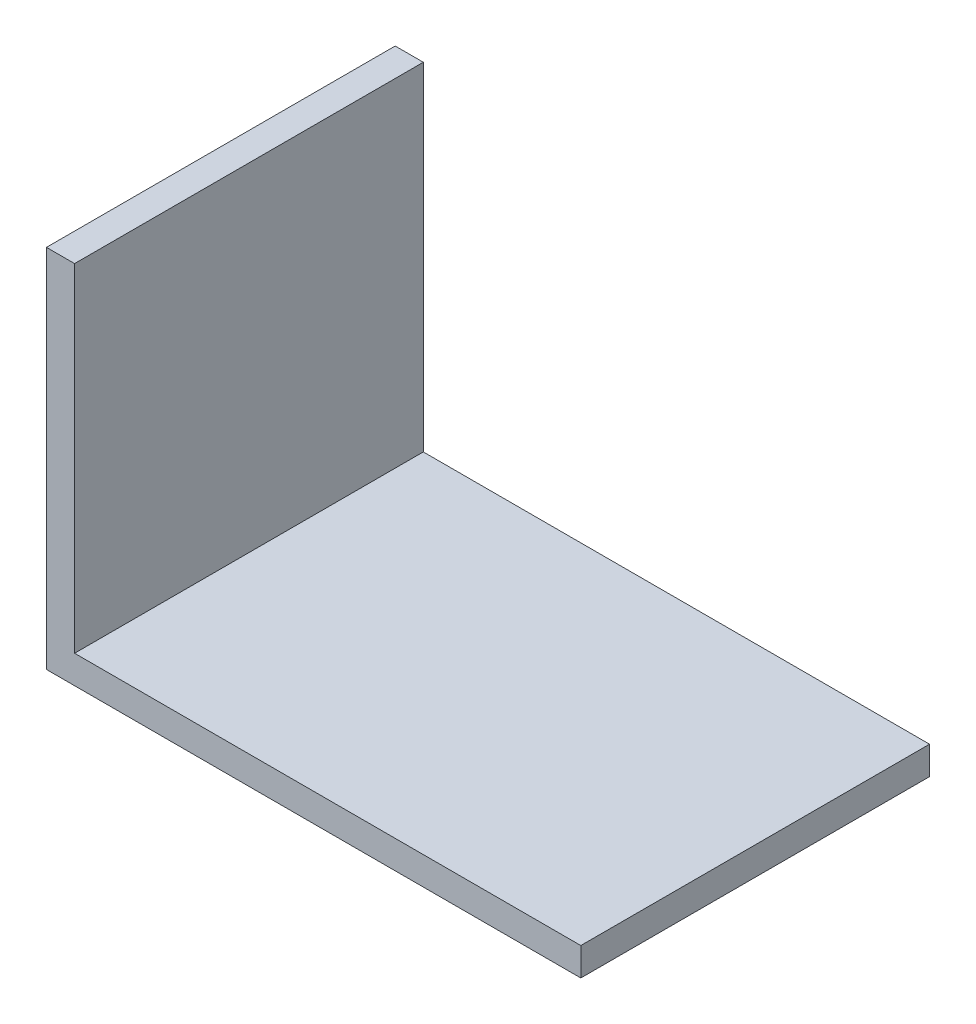
ISO-10303-21;
HEADER;
FILE_DESCRIPTION(('STEP AP214'),'2;1');
FILE_NAME('part.step','',(''),(''),'','','');
FILE_SCHEMA(('AUTOMOTIVE_DESIGN { 1 0 10303 214 1 1 1 1 }'));
ENDSEC;
DATA;
#1=APPLICATION_CONTEXT('core data for automotive mechanical design processes');
#2=APPLICATION_PROTOCOL_DEFINITION('international standard','automotive_design',2000,#1);
#3=PRODUCT_CONTEXT('',#1,'mechanical');
#4=PRODUCT('Part','Part','',(#3));
#5=PRODUCT_RELATED_PRODUCT_CATEGORY('part','',(#4));
#6=PRODUCT_DEFINITION_FORMATION('','',#4);
#7=PRODUCT_DEFINITION_CONTEXT('part definition',#1,'design');
#8=PRODUCT_DEFINITION('design','',#6,#7);
#9=PRODUCT_DEFINITION_SHAPE('','',#8);
#10=(LENGTH_UNIT() NAMED_UNIT(*) SI_UNIT(.MILLI.,.METRE.));
#11=(NAMED_UNIT(*) PLANE_ANGLE_UNIT() SI_UNIT($,.RADIAN.));
#12=(NAMED_UNIT(*) SI_UNIT($,.STERADIAN.) SOLID_ANGLE_UNIT());
#13=UNCERTAINTY_MEASURE_WITH_UNIT(LENGTH_MEASURE(1.E-05),#10,'distance_accuracy_value','');
#14=(GEOMETRIC_REPRESENTATION_CONTEXT(3) GLOBAL_UNCERTAINTY_ASSIGNED_CONTEXT((#13)) GLOBAL_UNIT_ASSIGNED_CONTEXT((#10,
#11,#12)) REPRESENTATION_CONTEXT('',''));
#15=CARTESIAN_POINT('',(0.,0.,0.));
#16=DIRECTION('',(0.,0.,1.));
#17=DIRECTION('',(1.,0.,0.));
#18=AXIS2_PLACEMENT_3D('',#15,#16,#17);
#19=CARTESIAN_POINT('',(2.5,-15.,15.5));
#20=DIRECTION('',(0.,0.,-1.));
#21=DIRECTION('',(-1.,0.,0.));
#22=AXIS2_PLACEMENT_3D('',#19,#20,#21);
#23=PLANE('',#22);
#24=DIRECTION('',(0.,-1.,0.));
#25=VECTOR('',#24,1.);
#26=CARTESIAN_POINT('',(0.,-15.,15.5));
#27=LINE('',#26,#25);
#28=CARTESIAN_POINT('',(0.,15.,15.5));
#29=VERTEX_POINT('',#28);
#30=CARTESIAN_POINT('',(0.,-17.5,15.5));
#31=VERTEX_POINT('',#30);
#32=EDGE_CURVE('E109',#29,#31,#27,.T.);
#33=ORIENTED_EDGE('',*,*,#32,.T.);
#34=DIRECTION('',(-1.,0.,0.));
#35=VECTOR('',#34,1.);
#36=CARTESIAN_POINT('',(47.5,-17.5,15.5));
#37=LINE('',#36,#35);
#38=CARTESIAN_POINT('',(47.5,-17.5,15.5));
#39=VERTEX_POINT('',#38);
#40=EDGE_CURVE('E113',#39,#31,#37,.T.);
#41=ORIENTED_EDGE('',*,*,#40,.F.);
#42=DIRECTION('',(0.,-1.,0.));
#43=VECTOR('',#42,1.);
#44=CARTESIAN_POINT('',(47.5,-15.,15.5));
#45=LINE('',#44,#43);
#46=CARTESIAN_POINT('',(47.5,-15.,15.5));
#47=VERTEX_POINT('',#46);
#48=EDGE_CURVE('E135',#47,#39,#45,.T.);
#49=ORIENTED_EDGE('',*,*,#48,.F.);
#50=DIRECTION('',(-1.,0.,0.));
#51=VECTOR('',#50,1.);
#52=CARTESIAN_POINT('',(47.5,-15.,15.5));
#53=LINE('',#52,#51);
#54=CARTESIAN_POINT('',(2.5,-15.,15.5));
#55=VERTEX_POINT('',#54);
#56=EDGE_CURVE('E94',#47,#55,#53,.T.);
#57=ORIENTED_EDGE('',*,*,#56,.T.);
#58=DIRECTION('',(0.,-1.,0.));
#59=VECTOR('',#58,1.);
#60=CARTESIAN_POINT('',(2.5,-15.,15.5));
#61=LINE('',#60,#59);
#62=CARTESIAN_POINT('',(2.5,15.,15.5));
#63=VERTEX_POINT('',#62);
#64=EDGE_CURVE('E99',#63,#55,#61,.T.);
#65=ORIENTED_EDGE('',*,*,#64,.F.);
#66=DIRECTION('',(-1.,0.,0.));
#67=VECTOR('',#66,1.);
#68=CARTESIAN_POINT('',(2.5,15.,15.5));
#69=LINE('',#68,#67);
#70=EDGE_CURVE('E48',#63,#29,#69,.T.);
#71=ORIENTED_EDGE('',*,*,#70,.T.);
#72=EDGE_LOOP('',(#33,#41,#49,#57,#65,#71));
#73=FACE_BOUND('',#72,.T.);
#74=ADVANCED_FACE('F39',(#73),#23,.F.);
#75=CARTESIAN_POINT('',(2.5,-15.,-15.5));
#76=DIRECTION('',(0.,0.,1.));
#77=DIRECTION('',(1.,0.,0.));
#78=AXIS2_PLACEMENT_3D('',#75,#76,#77);
#79=PLANE('',#78);
#80=DIRECTION('',(0.,1.,0.));
#81=VECTOR('',#80,1.);
#82=CARTESIAN_POINT('',(0.,-15.,-15.5));
#83=LINE('',#82,#81);
#84=CARTESIAN_POINT('',(0.,-17.5,-15.5));
#85=VERTEX_POINT('',#84);
#86=CARTESIAN_POINT('',(0.,15.,-15.5));
#87=VERTEX_POINT('',#86);
#88=EDGE_CURVE('E68',#85,#87,#83,.T.);
#89=ORIENTED_EDGE('',*,*,#88,.T.);
#90=DIRECTION('',(-1.,0.,0.));
#91=VECTOR('',#90,1.);
#92=CARTESIAN_POINT('',(2.5,15.,-15.5));
#93=LINE('',#92,#91);
#94=CARTESIAN_POINT('',(2.5,15.,-15.5));
#95=VERTEX_POINT('',#94);
#96=EDGE_CURVE('E11',#95,#87,#93,.T.);
#97=ORIENTED_EDGE('',*,*,#96,.F.);
#98=DIRECTION('',(0.,1.,0.));
#99=VECTOR('',#98,1.);
#100=CARTESIAN_POINT('',(2.5,-15.,-15.5));
#101=LINE('',#100,#99);
#102=CARTESIAN_POINT('',(2.5,-15.,-15.5));
#103=VERTEX_POINT('',#102);
#104=EDGE_CURVE('E97',#103,#95,#101,.T.);
#105=ORIENTED_EDGE('',*,*,#104,.F.);
#106=DIRECTION('',(-1.,0.,0.));
#107=VECTOR('',#106,1.);
#108=CARTESIAN_POINT('',(47.5,-15.,-15.5));
#109=LINE('',#108,#107);
#110=CARTESIAN_POINT('',(47.5,-15.,-15.5));
#111=VERTEX_POINT('',#110);
#112=EDGE_CURVE('E87',#111,#103,#109,.T.);
#113=ORIENTED_EDGE('',*,*,#112,.F.);
#114=DIRECTION('',(0.,1.,0.));
#115=VECTOR('',#114,1.);
#116=CARTESIAN_POINT('',(47.5,-15.,-15.5));
#117=LINE('',#116,#115);
#118=CARTESIAN_POINT('',(47.5,-17.5,-15.5));
#119=VERTEX_POINT('',#118);
#120=EDGE_CURVE('E154',#119,#111,#117,.T.);
#121=ORIENTED_EDGE('',*,*,#120,.F.);
#122=DIRECTION('',(-1.,0.,0.));
#123=VECTOR('',#122,1.);
#124=CARTESIAN_POINT('',(47.5,-17.5,-15.5));
#125=LINE('',#124,#123);
#126=EDGE_CURVE('E93',#119,#85,#125,.T.);
#127=ORIENTED_EDGE('',*,*,#126,.T.);
#128=EDGE_LOOP('',(#89,#97,#105,#113,#121,#127));
#129=FACE_BOUND('',#128,.T.);
#130=ADVANCED_FACE('F102',(#129),#79,.F.);
#131=CARTESIAN_POINT('',(2.5,15.,-15.5));
#132=DIRECTION('',(0.,-1.,0.));
#133=DIRECTION('',(0.,0.,-1.));
#134=AXIS2_PLACEMENT_3D('',#131,#132,#133);
#135=PLANE('',#134);
#136=DIRECTION('',(0.,0.,1.));
#137=VECTOR('',#136,1.);
#138=CARTESIAN_POINT('',(0.,15.,-15.5));
#139=LINE('',#138,#137);
#140=EDGE_CURVE('E116',#87,#29,#139,.T.);
#141=ORIENTED_EDGE('',*,*,#140,.T.);
#142=ORIENTED_EDGE('',*,*,#70,.F.);
#143=DIRECTION('',(0.,0.,1.));
#144=VECTOR('',#143,1.);
#145=CARTESIAN_POINT('',(2.5,15.,-15.5));
#146=LINE('',#145,#144);
#147=EDGE_CURVE('E56',#95,#63,#146,.T.);
#148=ORIENTED_EDGE('',*,*,#147,.F.);
#149=ORIENTED_EDGE('',*,*,#96,.T.);
#150=EDGE_LOOP('',(#141,#142,#148,#149));
#151=FACE_BOUND('',#150,.T.);
#152=ADVANCED_FACE('F177',(#151),#135,.F.);
#153=CARTESIAN_POINT('',(2.5,0.,0.));
#154=DIRECTION('',(1.,0.,0.));
#155=DIRECTION('',(0.,0.,-1.));
#156=AXIS2_PLACEMENT_3D('',#153,#154,#155);
#157=PLANE('',#156);
#158=ORIENTED_EDGE('',*,*,#64,.T.);
#159=DIRECTION('',(0.,0.,-1.));
#160=VECTOR('',#159,1.);
#161=CARTESIAN_POINT('',(2.5,-15.,-15.5));
#162=LINE('',#161,#160);
#163=EDGE_CURVE('E77',#55,#103,#162,.T.);
#164=ORIENTED_EDGE('',*,*,#163,.T.);
#165=ORIENTED_EDGE('',*,*,#104,.T.);
#166=ORIENTED_EDGE('',*,*,#147,.T.);
#167=EDGE_LOOP('',(#158,#164,#165,#166));
#168=FACE_BOUND('',#167,.T.);
#169=ADVANCED_FACE('F96',(#168),#157,.T.);
#170=CARTESIAN_POINT('',(0.,0.,0.));
#171=DIRECTION('',(1.,0.,0.));
#172=DIRECTION('',(0.,0.,-1.));
#173=AXIS2_PLACEMENT_3D('',#170,#171,#172);
#174=PLANE('',#173);
#175=ORIENTED_EDGE('',*,*,#32,.F.);
#176=ORIENTED_EDGE('',*,*,#140,.F.);
#177=ORIENTED_EDGE('',*,*,#88,.F.);
#178=DIRECTION('',(0.,0.,-1.));
#179=VECTOR('',#178,1.);
#180=CARTESIAN_POINT('',(0.,-17.5,15.5));
#181=LINE('',#180,#179);
#182=EDGE_CURVE('E130',#31,#85,#181,.T.);
#183=ORIENTED_EDGE('',*,*,#182,.F.);
#184=EDGE_LOOP('',(#175,#176,#177,#183));
#185=FACE_BOUND('',#184,.T.);
#186=ADVANCED_FACE('F128',(#185),#174,.F.);
#187=CARTESIAN_POINT('',(47.5,-17.5,15.5));
#188=DIRECTION('',(0.,1.,0.));
#189=DIRECTION('',(0.,0.,1.));
#190=AXIS2_PLACEMENT_3D('',#187,#188,#189);
#191=PLANE('',#190);
#192=ORIENTED_EDGE('',*,*,#182,.T.);
#193=ORIENTED_EDGE('',*,*,#126,.F.);
#194=DIRECTION('',(0.,0.,-1.));
#195=VECTOR('',#194,1.);
#196=CARTESIAN_POINT('',(47.5,-17.5,15.5));
#197=LINE('',#196,#195);
#198=EDGE_CURVE('E141',#39,#119,#197,.T.);
#199=ORIENTED_EDGE('',*,*,#198,.F.);
#200=ORIENTED_EDGE('',*,*,#40,.T.);
#201=EDGE_LOOP('',(#192,#193,#199,#200));
#202=FACE_BOUND('',#201,.T.);
#203=ADVANCED_FACE('F138',(#202),#191,.F.);
#204=CARTESIAN_POINT('',(47.5,-15.,15.5));
#205=DIRECTION('',(0.,-1.,0.));
#206=DIRECTION('',(0.,0.,-1.));
#207=AXIS2_PLACEMENT_3D('',#204,#205,#206);
#208=PLANE('',#207);
#209=ORIENTED_EDGE('',*,*,#163,.F.);
#210=ORIENTED_EDGE('',*,*,#56,.F.);
#211=DIRECTION('',(0.,0.,1.));
#212=VECTOR('',#211,1.);
#213=CARTESIAN_POINT('',(47.5,-15.,15.5));
#214=LINE('',#213,#212);
#215=EDGE_CURVE('E89',#111,#47,#214,.T.);
#216=ORIENTED_EDGE('',*,*,#215,.F.);
#217=ORIENTED_EDGE('',*,*,#112,.T.);
#218=EDGE_LOOP('',(#209,#210,#216,#217));
#219=FACE_BOUND('',#218,.T.);
#220=ADVANCED_FACE('F88',(#219),#208,.F.);
#221=CARTESIAN_POINT('',(47.5,0.,0.));
#222=DIRECTION('',(1.,0.,0.));
#223=DIRECTION('',(0.,0.,-1.));
#224=AXIS2_PLACEMENT_3D('',#221,#222,#223);
#225=PLANE('',#224);
#226=ORIENTED_EDGE('',*,*,#48,.T.);
#227=ORIENTED_EDGE('',*,*,#198,.T.);
#228=ORIENTED_EDGE('',*,*,#120,.T.);
#229=ORIENTED_EDGE('',*,*,#215,.T.);
#230=EDGE_LOOP('',(#226,#227,#228,#229));
#231=FACE_BOUND('',#230,.T.);
#232=ADVANCED_FACE('F162',(#231),#225,.T.);
#233=CLOSED_SHELL('',(#74,#130,#152,#169,#186,#203,#220,#232));
#234=MANIFOLD_SOLID_BREP('B2',#233);
#235=ADVANCED_BREP_SHAPE_REPRESENTATION('',(#18,#234),#14);
#236=SHAPE_DEFINITION_REPRESENTATION(#9,#235);
ENDSEC;
END-ISO-10303-21;
